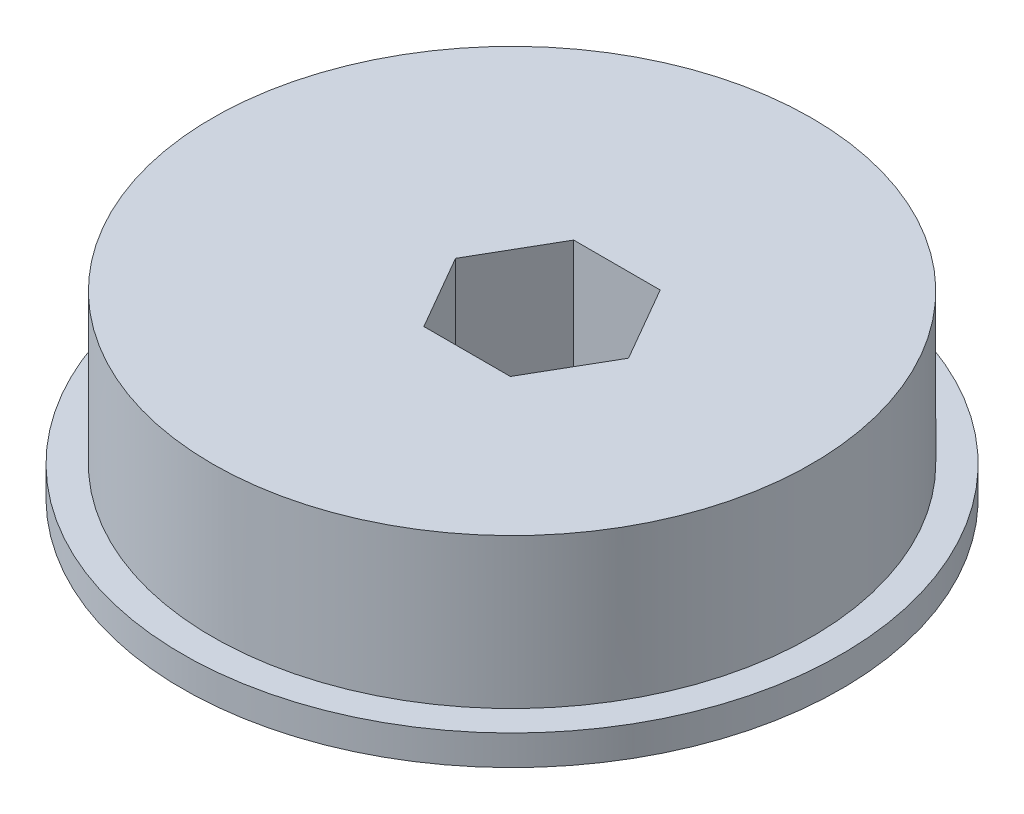
ISO-10303-21;
HEADER;
FILE_DESCRIPTION(('STEP AP214'),'2;1');
FILE_NAME('part.step','',(''),(''),'','','');
FILE_SCHEMA(('AUTOMOTIVE_DESIGN { 1 0 10303 214 1 1 1 1 }'));
ENDSEC;
DATA;
#1=APPLICATION_CONTEXT('core data for automotive mechanical design processes');
#2=APPLICATION_PROTOCOL_DEFINITION('international standard','automotive_design',2000,#1);
#3=PRODUCT_CONTEXT('',#1,'mechanical');
#4=PRODUCT('Part','Part','',(#3));
#5=PRODUCT_RELATED_PRODUCT_CATEGORY('part','',(#4));
#6=PRODUCT_DEFINITION_FORMATION('','',#4);
#7=PRODUCT_DEFINITION_CONTEXT('part definition',#1,'design');
#8=PRODUCT_DEFINITION('design','',#6,#7);
#9=PRODUCT_DEFINITION_SHAPE('','',#8);
#10=(LENGTH_UNIT() NAMED_UNIT(*) SI_UNIT(.MILLI.,.METRE.));
#11=(NAMED_UNIT(*) PLANE_ANGLE_UNIT() SI_UNIT($,.RADIAN.));
#12=(NAMED_UNIT(*) SI_UNIT($,.STERADIAN.) SOLID_ANGLE_UNIT());
#13=UNCERTAINTY_MEASURE_WITH_UNIT(LENGTH_MEASURE(1.E-05),#10,'distance_accuracy_value','');
#14=(GEOMETRIC_REPRESENTATION_CONTEXT(3) GLOBAL_UNCERTAINTY_ASSIGNED_CONTEXT((#13)) GLOBAL_UNIT_ASSIGNED_CONTEXT((#10,
#11,#12)) REPRESENTATION_CONTEXT('',''));
#15=CARTESIAN_POINT('',(0.,0.,0.));
#16=DIRECTION('',(0.,0.,1.));
#17=DIRECTION('',(1.,0.,0.));
#18=AXIS2_PLACEMENT_3D('',#15,#16,#17);
#19=CARTESIAN_POINT('',(-1.,6.,0.));
#20=DIRECTION('',(0.,-1.,0.));
#21=DIRECTION('',(0.,0.,-1.));
#22=AXIS2_PLACEMENT_3D('',#19,#20,#21);
#23=CYLINDRICAL_SURFACE('',#22,10.);
#24=CARTESIAN_POINT('',(-1.,6.,0.));
#25=DIRECTION('',(0.,1.,0.));
#26=DIRECTION('',(0.,0.,1.));
#27=AXIS2_PLACEMENT_3D('',#24,#25,#26);
#28=CIRCLE('',#27,10.);
#29=CARTESIAN_POINT('',(-1.,6.,10.));
#30=VERTEX_POINT('',#29);
#31=EDGE_CURVE('E42',#30,#30,#28,.T.);
#32=ORIENTED_EDGE('',*,*,#31,.F.);
#33=EDGE_LOOP('',(#32));
#34=FACE_BOUND('',#33,.T.);
#35=CARTESIAN_POINT('',(-1.,1.,0.));
#36=DIRECTION('',(0.,-1.,0.));
#37=DIRECTION('',(0.,0.,-1.));
#38=AXIS2_PLACEMENT_3D('',#35,#36,#37);
#39=CIRCLE('',#38,10.);
#40=CARTESIAN_POINT('',(-1.,1.,-10.));
#41=VERTEX_POINT('',#40);
#42=EDGE_CURVE('E11',#41,#41,#39,.T.);
#43=ORIENTED_EDGE('',*,*,#42,.F.);
#44=EDGE_LOOP('',(#43));
#45=FACE_BOUND('',#44,.T.);
#46=ADVANCED_FACE('F35',(#34,#45),#23,.T.);
#47=CARTESIAN_POINT('',(-1.,6.,0.));
#48=DIRECTION('',(0.,1.,0.));
#49=DIRECTION('',(0.,0.,1.));
#50=AXIS2_PLACEMENT_3D('',#47,#48,#49);
#51=PLANE('',#50);
#52=DIRECTION('',(0.5,0.,-0.866025403784439));
#53=VECTOR('',#52,1.);
#54=CARTESIAN_POINT('',(1.44337567297406,6.,2.5));
#55=LINE('',#54,#53);
#56=CARTESIAN_POINT('',(1.44337567297406,6.,2.5));
#57=VERTEX_POINT('',#56);
#58=CARTESIAN_POINT('',(2.88675134594813,6.,0.));
#59=VERTEX_POINT('',#58);
#60=EDGE_CURVE('E49',#57,#59,#55,.T.);
#61=ORIENTED_EDGE('',*,*,#60,.F.);
#62=DIRECTION('',(1.,0.,0.));
#63=VECTOR('',#62,1.);
#64=CARTESIAN_POINT('',(-1.44337567297407,6.,2.5));
#65=LINE('',#64,#63);
#66=CARTESIAN_POINT('',(-1.44337567297407,6.,2.5));
#67=VERTEX_POINT('',#66);
#68=EDGE_CURVE('E106',#67,#57,#65,.T.);
#69=ORIENTED_EDGE('',*,*,#68,.F.);
#70=DIRECTION('',(0.5,0.,0.866025403784439));
#71=VECTOR('',#70,1.);
#72=CARTESIAN_POINT('',(-2.88675134594813,6.,0.));
#73=LINE('',#72,#71);
#74=CARTESIAN_POINT('',(-2.88675134594813,6.,0.));
#75=VERTEX_POINT('',#74);
#76=EDGE_CURVE('E109',#75,#67,#73,.T.);
#77=ORIENTED_EDGE('',*,*,#76,.F.);
#78=DIRECTION('',(-0.5,0.,0.866025403784439));
#79=VECTOR('',#78,1.);
#80=CARTESIAN_POINT('',(-1.44337567297406,6.,-2.5));
#81=LINE('',#80,#79);
#82=CARTESIAN_POINT('',(-1.44337567297406,6.,-2.5));
#83=VERTEX_POINT('',#82);
#84=EDGE_CURVE('E125',#83,#75,#81,.T.);
#85=ORIENTED_EDGE('',*,*,#84,.F.);
#86=DIRECTION('',(-1.,0.,0.));
#87=VECTOR('',#86,1.);
#88=CARTESIAN_POINT('',(1.44337567297406,6.,-2.5));
#89=LINE('',#88,#87);
#90=CARTESIAN_POINT('',(1.44337567297406,6.,-2.5));
#91=VERTEX_POINT('',#90);
#92=EDGE_CURVE('E122',#91,#83,#89,.T.);
#93=ORIENTED_EDGE('',*,*,#92,.F.);
#94=DIRECTION('',(-0.5,0.,-0.866025403784439));
#95=VECTOR('',#94,1.);
#96=CARTESIAN_POINT('',(2.88675134594813,6.,0.));
#97=LINE('',#96,#95);
#98=EDGE_CURVE('E120',#59,#91,#97,.T.);
#99=ORIENTED_EDGE('',*,*,#98,.F.);
#100=EDGE_LOOP('',(#61,#69,#77,#85,#93,#99));
#101=FACE_BOUND('',#100,.T.);
#102=ORIENTED_EDGE('',*,*,#31,.T.);
#103=EDGE_LOOP('',(#102));
#104=FACE_BOUND('',#103,.T.);
#105=ADVANCED_FACE('F147',(#101,#104),#51,.T.);
#106=CARTESIAN_POINT('',(-1.,1.,0.));
#107=DIRECTION('',(0.,-1.,0.));
#108=DIRECTION('',(0.,0.,-1.));
#109=AXIS2_PLACEMENT_3D('',#106,#107,#108);
#110=CYLINDRICAL_SURFACE('',#109,11.);
#111=CARTESIAN_POINT('',(-1.,1.,0.));
#112=DIRECTION('',(0.,-1.,0.));
#113=DIRECTION('',(0.,0.,-1.));
#114=AXIS2_PLACEMENT_3D('',#111,#112,#113);
#115=CIRCLE('',#114,11.);
#116=CARTESIAN_POINT('',(-1.,1.,-11.));
#117=VERTEX_POINT('',#116);
#118=EDGE_CURVE('E140',#117,#117,#115,.T.);
#119=ORIENTED_EDGE('',*,*,#118,.T.);
#120=EDGE_LOOP('',(#119));
#121=FACE_BOUND('',#120,.T.);
#122=CARTESIAN_POINT('',(-1.,0.,0.));
#123=DIRECTION('',(0.,-1.,0.));
#124=DIRECTION('',(0.,0.,-1.));
#125=AXIS2_PLACEMENT_3D('',#122,#123,#124);
#126=CIRCLE('',#125,11.);
#127=CARTESIAN_POINT('',(-1.,0.,-11.));
#128=VERTEX_POINT('',#127);
#129=EDGE_CURVE('E132',#128,#128,#126,.T.);
#130=ORIENTED_EDGE('',*,*,#129,.F.);
#131=EDGE_LOOP('',(#130));
#132=FACE_BOUND('',#131,.T.);
#133=ADVANCED_FACE('F156',(#121,#132),#110,.T.);
#134=CARTESIAN_POINT('',(-1.,1.,0.));
#135=DIRECTION('',(0.,-1.,0.));
#136=DIRECTION('',(0.,0.,-1.));
#137=AXIS2_PLACEMENT_3D('',#134,#135,#136);
#138=PLANE('',#137);
#139=ORIENTED_EDGE('',*,*,#42,.T.);
#140=EDGE_LOOP('',(#139));
#141=FACE_BOUND('',#140,.T.);
#142=ORIENTED_EDGE('',*,*,#118,.F.);
#143=EDGE_LOOP('',(#142));
#144=FACE_BOUND('',#143,.T.);
#145=ADVANCED_FACE('F153',(#141,#144),#138,.F.);
#146=CARTESIAN_POINT('',(-1.,0.,0.));
#147=DIRECTION('',(0.,1.,0.));
#148=DIRECTION('',(0.,0.,1.));
#149=AXIS2_PLACEMENT_3D('',#146,#147,#148);
#150=PLANE('',#149);
#151=DIRECTION('',(1.,0.,0.));
#152=VECTOR('',#151,1.);
#153=CARTESIAN_POINT('',(-1.44337567297407,0.,2.5));
#154=LINE('',#153,#152);
#155=CARTESIAN_POINT('',(-1.44337567297407,0.,2.5));
#156=VERTEX_POINT('',#155);
#157=CARTESIAN_POINT('',(1.44337567297406,0.,2.5));
#158=VERTEX_POINT('',#157);
#159=EDGE_CURVE('E95',#156,#158,#154,.T.);
#160=ORIENTED_EDGE('',*,*,#159,.T.);
#161=DIRECTION('',(0.5,0.,-0.866025403784439));
#162=VECTOR('',#161,1.);
#163=CARTESIAN_POINT('',(1.44337567297406,0.,2.5));
#164=LINE('',#163,#162);
#165=CARTESIAN_POINT('',(2.88675134594813,0.,0.));
#166=VERTEX_POINT('',#165);
#167=EDGE_CURVE('E89',#158,#166,#164,.T.);
#168=ORIENTED_EDGE('',*,*,#167,.T.);
#169=DIRECTION('',(-0.5,0.,-0.866025403784439));
#170=VECTOR('',#169,1.);
#171=CARTESIAN_POINT('',(2.88675134594813,0.,0.));
#172=LINE('',#171,#170);
#173=CARTESIAN_POINT('',(1.44337567297406,0.,-2.5));
#174=VERTEX_POINT('',#173);
#175=EDGE_CURVE('E98',#166,#174,#172,.T.);
#176=ORIENTED_EDGE('',*,*,#175,.T.);
#177=DIRECTION('',(-1.,0.,0.));
#178=VECTOR('',#177,1.);
#179=CARTESIAN_POINT('',(1.44337567297406,0.,-2.5));
#180=LINE('',#179,#178);
#181=CARTESIAN_POINT('',(-1.44337567297406,0.,-2.5));
#182=VERTEX_POINT('',#181);
#183=EDGE_CURVE('E57',#174,#182,#180,.T.);
#184=ORIENTED_EDGE('',*,*,#183,.T.);
#185=DIRECTION('',(-0.5,0.,0.866025403784439));
#186=VECTOR('',#185,1.);
#187=CARTESIAN_POINT('',(-1.44337567297406,0.,-2.5));
#188=LINE('',#187,#186);
#189=CARTESIAN_POINT('',(-2.88675134594813,0.,0.));
#190=VERTEX_POINT('',#189);
#191=EDGE_CURVE('E113',#182,#190,#188,.T.);
#192=ORIENTED_EDGE('',*,*,#191,.T.);
#193=DIRECTION('',(0.5,0.,0.866025403784439));
#194=VECTOR('',#193,1.);
#195=CARTESIAN_POINT('',(-2.88675134594813,0.,0.));
#196=LINE('',#195,#194);
#197=EDGE_CURVE('E116',#190,#156,#196,.T.);
#198=ORIENTED_EDGE('',*,*,#197,.T.);
#199=EDGE_LOOP('',(#160,#168,#176,#184,#192,#198));
#200=FACE_BOUND('',#199,.T.);
#201=ORIENTED_EDGE('',*,*,#129,.T.);
#202=EDGE_LOOP('',(#201));
#203=FACE_BOUND('',#202,.T.);
#204=ADVANCED_FACE('F102',(#200,#203),#150,.F.);
#205=CARTESIAN_POINT('',(1.44337567297406,0.,2.5));
#206=DIRECTION('',(0.866025403784439,0.,0.5));
#207=DIRECTION('',(0.5,0.,-0.866025403784439));
#208=AXIS2_PLACEMENT_3D('',#205,#206,#207);
#209=PLANE('',#208);
#210=ORIENTED_EDGE('',*,*,#60,.T.);
#211=DIRECTION('',(0.,1.,0.));
#212=VECTOR('',#211,1.);
#213=CARTESIAN_POINT('',(2.88675134594813,0.,0.));
#214=LINE('',#213,#212);
#215=EDGE_CURVE('E85',#166,#59,#214,.T.);
#216=ORIENTED_EDGE('',*,*,#215,.F.);
#217=ORIENTED_EDGE('',*,*,#167,.F.);
#218=DIRECTION('',(0.,1.,0.));
#219=VECTOR('',#218,1.);
#220=CARTESIAN_POINT('',(1.44337567297406,0.,2.5));
#221=LINE('',#220,#219);
#222=EDGE_CURVE('E130',#158,#57,#221,.T.);
#223=ORIENTED_EDGE('',*,*,#222,.T.);
#224=EDGE_LOOP('',(#210,#216,#217,#223));
#225=FACE_BOUND('',#224,.T.);
#226=ADVANCED_FACE('F87',(#225),#209,.F.);
#227=CARTESIAN_POINT('',(-1.44337567297407,0.,2.5));
#228=DIRECTION('',(0.,0.,1.));
#229=DIRECTION('',(1.,0.,0.));
#230=AXIS2_PLACEMENT_3D('',#227,#228,#229);
#231=PLANE('',#230);
#232=ORIENTED_EDGE('',*,*,#68,.T.);
#233=ORIENTED_EDGE('',*,*,#222,.F.);
#234=ORIENTED_EDGE('',*,*,#159,.F.);
#235=DIRECTION('',(0.,1.,0.));
#236=VECTOR('',#235,1.);
#237=CARTESIAN_POINT('',(-1.44337567297407,0.,2.5));
#238=LINE('',#237,#236);
#239=EDGE_CURVE('E133',#156,#67,#238,.T.);
#240=ORIENTED_EDGE('',*,*,#239,.T.);
#241=EDGE_LOOP('',(#232,#233,#234,#240));
#242=FACE_BOUND('',#241,.T.);
#243=ADVANCED_FACE('F168',(#242),#231,.F.);
#244=CARTESIAN_POINT('',(-2.88675134594813,0.,0.));
#245=DIRECTION('',(-0.866025403784439,0.,0.5));
#246=DIRECTION('',(0.5,0.,0.866025403784439));
#247=AXIS2_PLACEMENT_3D('',#244,#245,#246);
#248=PLANE('',#247);
#249=ORIENTED_EDGE('',*,*,#76,.T.);
#250=ORIENTED_EDGE('',*,*,#239,.F.);
#251=ORIENTED_EDGE('',*,*,#197,.F.);
#252=DIRECTION('',(0.,1.,0.));
#253=VECTOR('',#252,1.);
#254=CARTESIAN_POINT('',(-2.88675134594813,0.,0.));
#255=LINE('',#254,#253);
#256=EDGE_CURVE('E135',#190,#75,#255,.T.);
#257=ORIENTED_EDGE('',*,*,#256,.T.);
#258=EDGE_LOOP('',(#249,#250,#251,#257));
#259=FACE_BOUND('',#258,.T.);
#260=ADVANCED_FACE('F182',(#259),#248,.F.);
#261=CARTESIAN_POINT('',(-1.44337567297406,0.,-2.5));
#262=DIRECTION('',(-0.866025403784439,0.,-0.5));
#263=DIRECTION('',(-0.5,0.,0.866025403784439));
#264=AXIS2_PLACEMENT_3D('',#261,#262,#263);
#265=PLANE('',#264);
#266=ORIENTED_EDGE('',*,*,#84,.T.);
#267=ORIENTED_EDGE('',*,*,#256,.F.);
#268=ORIENTED_EDGE('',*,*,#191,.F.);
#269=DIRECTION('',(0.,1.,0.));
#270=VECTOR('',#269,1.);
#271=CARTESIAN_POINT('',(-1.44337567297406,0.,-2.5));
#272=LINE('',#271,#270);
#273=EDGE_CURVE('E137',#182,#83,#272,.T.);
#274=ORIENTED_EDGE('',*,*,#273,.T.);
#275=EDGE_LOOP('',(#266,#267,#268,#274));
#276=FACE_BOUND('',#275,.T.);
#277=ADVANCED_FACE('F179',(#276),#265,.F.);
#278=CARTESIAN_POINT('',(1.44337567297406,0.,-2.5));
#279=DIRECTION('',(0.,0.,-1.));
#280=DIRECTION('',(-1.,0.,0.));
#281=AXIS2_PLACEMENT_3D('',#278,#279,#280);
#282=PLANE('',#281);
#283=ORIENTED_EDGE('',*,*,#92,.T.);
#284=ORIENTED_EDGE('',*,*,#273,.F.);
#285=ORIENTED_EDGE('',*,*,#183,.F.);
#286=DIRECTION('',(0.,1.,0.));
#287=VECTOR('',#286,1.);
#288=CARTESIAN_POINT('',(1.44337567297406,0.,-2.5));
#289=LINE('',#288,#287);
#290=EDGE_CURVE('E94',#174,#91,#289,.T.);
#291=ORIENTED_EDGE('',*,*,#290,.T.);
#292=EDGE_LOOP('',(#283,#284,#285,#291));
#293=FACE_BOUND('',#292,.T.);
#294=ADVANCED_FACE('F176',(#293),#282,.F.);
#295=CARTESIAN_POINT('',(2.88675134594813,0.,0.));
#296=DIRECTION('',(0.866025403784439,0.,-0.5));
#297=DIRECTION('',(-0.5,0.,-0.866025403784439));
#298=AXIS2_PLACEMENT_3D('',#295,#296,#297);
#299=PLANE('',#298);
#300=ORIENTED_EDGE('',*,*,#98,.T.);
#301=ORIENTED_EDGE('',*,*,#290,.F.);
#302=ORIENTED_EDGE('',*,*,#175,.F.);
#303=ORIENTED_EDGE('',*,*,#215,.T.);
#304=EDGE_LOOP('',(#300,#301,#302,#303));
#305=FACE_BOUND('',#304,.T.);
#306=ADVANCED_FACE('F99',(#305),#299,.F.);
#307=CLOSED_SHELL('',(#46,#105,#133,#145,#204,#226,#243,#260,#277,#294,#306));
#308=MANIFOLD_SOLID_BREP('B2',#307);
#309=ADVANCED_BREP_SHAPE_REPRESENTATION('',(#18,#308),#14);
#310=SHAPE_DEFINITION_REPRESENTATION(#9,#309);
ENDSEC;
END-ISO-10303-21;
